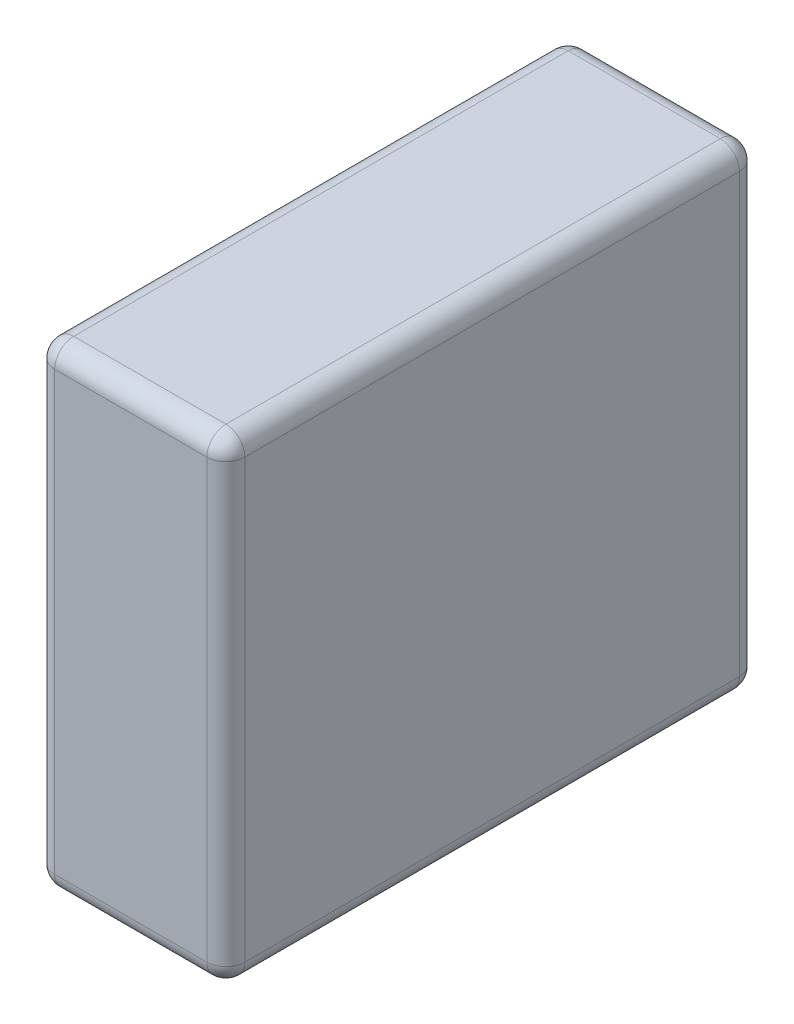
ISO-10303-21;
HEADER;
FILE_DESCRIPTION(('STEP AP214'),'2;1');
FILE_NAME('part.step','',(''),(''),'','','');
FILE_SCHEMA(('AUTOMOTIVE_DESIGN { 1 0 10303 214 1 1 1 1 }'));
ENDSEC;
DATA;
#1=APPLICATION_CONTEXT('core data for automotive mechanical design processes');
#2=APPLICATION_PROTOCOL_DEFINITION('international standard','automotive_design',2000,#1);
#3=PRODUCT_CONTEXT('',#1,'mechanical');
#4=PRODUCT('Part','Part','',(#3));
#5=PRODUCT_RELATED_PRODUCT_CATEGORY('part','',(#4));
#6=PRODUCT_DEFINITION_FORMATION('','',#4);
#7=PRODUCT_DEFINITION_CONTEXT('part definition',#1,'design');
#8=PRODUCT_DEFINITION('design','',#6,#7);
#9=PRODUCT_DEFINITION_SHAPE('','',#8);
#10=(LENGTH_UNIT() NAMED_UNIT(*) SI_UNIT(.MILLI.,.METRE.));
#11=(NAMED_UNIT(*) PLANE_ANGLE_UNIT() SI_UNIT($,.RADIAN.));
#12=(NAMED_UNIT(*) SI_UNIT($,.STERADIAN.) SOLID_ANGLE_UNIT());
#13=UNCERTAINTY_MEASURE_WITH_UNIT(LENGTH_MEASURE(1.E-05),#10,'distance_accuracy_value','');
#14=(GEOMETRIC_REPRESENTATION_CONTEXT(3) GLOBAL_UNCERTAINTY_ASSIGNED_CONTEXT((#13)) GLOBAL_UNIT_ASSIGNED_CONTEXT((#10,
#11,#12)) REPRESENTATION_CONTEXT('',''));
#15=CARTESIAN_POINT('',(0.,0.,0.));
#16=DIRECTION('',(0.,0.,1.));
#17=DIRECTION('',(1.,0.,0.));
#18=AXIS2_PLACEMENT_3D('',#15,#16,#17);
#19=CARTESIAN_POINT('',(-1.,-0.625,0.));
#20=DIRECTION('',(1.,0.,0.));
#21=DIRECTION('',(0.,1.,0.));
#22=AXIS2_PLACEMENT_3D('',#19,#20,#21);
#23=PLANE('',#22);
#24=DIRECTION('',(0.,1.,0.));
#25=VECTOR('',#24,1.);
#26=CARTESIAN_POINT('',(-1.,-0.625,1.35));
#27=LINE('',#26,#25);
#28=CARTESIAN_POINT('',(-1.,-0.575,1.35));
#29=VERTEX_POINT('',#28);
#30=CARTESIAN_POINT('',(-1.,0.575,1.35));
#31=VERTEX_POINT('',#30);
#32=EDGE_CURVE('E228',#29,#31,#27,.T.);
#33=ORIENTED_EDGE('',*,*,#32,.T.);
#34=DIRECTION('',(0.,0.,1.));
#35=VECTOR('',#34,1.);
#36=CARTESIAN_POINT('',(-1.,0.575,0.));
#37=LINE('',#36,#35);
#38=CARTESIAN_POINT('',(-1.,0.575,0.05));
#39=VERTEX_POINT('',#38);
#40=EDGE_CURVE('E198',#39,#31,#37,.T.);
#41=ORIENTED_EDGE('',*,*,#40,.F.);
#42=DIRECTION('',(0.,1.,0.));
#43=VECTOR('',#42,1.);
#44=CARTESIAN_POINT('',(-1.,-0.625,0.05));
#45=LINE('',#44,#43);
#46=CARTESIAN_POINT('',(-1.,-0.575,0.05));
#47=VERTEX_POINT('',#46);
#48=EDGE_CURVE('E27',#47,#39,#45,.T.);
#49=ORIENTED_EDGE('',*,*,#48,.F.);
#50=DIRECTION('',(0.,0.,1.));
#51=VECTOR('',#50,1.);
#52=CARTESIAN_POINT('',(-1.,-0.575,0.));
#53=LINE('',#52,#51);
#54=EDGE_CURVE('E11',#47,#29,#53,.T.);
#55=ORIENTED_EDGE('',*,*,#54,.T.);
#56=EDGE_LOOP('',(#33,#41,#49,#55));
#57=FACE_BOUND('',#56,.T.);
#58=ADVANCED_FACE('F16',(#57),#23,.F.);
#59=CARTESIAN_POINT('',(-0.95,-0.575,0.));
#60=DIRECTION('',(0.,0.,1.));
#61=DIRECTION('',(-1.,0.,0.));
#62=AXIS2_PLACEMENT_3D('',#59,#60,#61);
#63=CYLINDRICAL_SURFACE('',#62,0.05);
#64=ORIENTED_EDGE('',*,*,#54,.F.);
#65=CARTESIAN_POINT('',(-0.95,-0.575,0.05));
#66=DIRECTION('',(0.,0.,1.));
#67=DIRECTION('',(-1.,0.,0.));
#68=AXIS2_PLACEMENT_3D('',#65,#66,#67);
#69=CIRCLE('',#68,0.05);
#70=CARTESIAN_POINT('',(-0.95,-0.625,0.05));
#71=VERTEX_POINT('',#70);
#72=EDGE_CURVE('E195',#47,#71,#69,.T.);
#73=ORIENTED_EDGE('',*,*,#72,.T.);
#74=DIRECTION('',(0.,0.,1.));
#75=VECTOR('',#74,1.);
#76=CARTESIAN_POINT('',(-0.95,-0.625,0.));
#77=LINE('',#76,#75);
#78=CARTESIAN_POINT('',(-0.95,-0.625,1.35));
#79=VERTEX_POINT('',#78);
#80=EDGE_CURVE('E191',#71,#79,#77,.T.);
#81=ORIENTED_EDGE('',*,*,#80,.T.);
#82=CARTESIAN_POINT('',(-0.95,-0.575,1.35));
#83=DIRECTION('',(0.,0.,1.));
#84=DIRECTION('',(-1.,0.,0.));
#85=AXIS2_PLACEMENT_3D('',#82,#83,#84);
#86=CIRCLE('',#85,0.05);
#87=EDGE_CURVE('E187',#29,#79,#86,.T.);
#88=ORIENTED_EDGE('',*,*,#87,.F.);
#89=EDGE_LOOP('',(#64,#73,#81,#88));
#90=FACE_BOUND('',#89,.T.);
#91=ADVANCED_FACE('F288',(#90),#63,.T.);
#92=CARTESIAN_POINT('',(-0.95,-0.625,0.05));
#93=DIRECTION('',(0.,1.,0.));
#94=DIRECTION('',(-1.,0.,0.));
#95=AXIS2_PLACEMENT_3D('',#92,#93,#94);
#96=CYLINDRICAL_SURFACE('',#95,0.05);
#97=ORIENTED_EDGE('',*,*,#48,.T.);
#98=CARTESIAN_POINT('',(-0.95,0.575,0.05));
#99=DIRECTION('',(0.,1.,0.));
#100=DIRECTION('',(-1.,0.,0.));
#101=AXIS2_PLACEMENT_3D('',#98,#99,#100);
#102=CIRCLE('',#101,0.05);
#103=CARTESIAN_POINT('',(-0.95,0.575,0.));
#104=VERTEX_POINT('',#103);
#105=EDGE_CURVE('E247',#104,#39,#102,.T.);
#106=ORIENTED_EDGE('',*,*,#105,.F.);
#107=DIRECTION('',(0.,1.,0.));
#108=VECTOR('',#107,1.);
#109=CARTESIAN_POINT('',(-0.95,-0.625,0.));
#110=LINE('',#109,#108);
#111=CARTESIAN_POINT('',(-0.95,-0.575,0.));
#112=VERTEX_POINT('',#111);
#113=EDGE_CURVE('E203',#112,#104,#110,.T.);
#114=ORIENTED_EDGE('',*,*,#113,.F.);
#115=CARTESIAN_POINT('',(-0.95,-0.575,0.05));
#116=DIRECTION('',(0.,1.,0.));
#117=DIRECTION('',(-1.,0.,0.));
#118=AXIS2_PLACEMENT_3D('',#115,#116,#117);
#119=CIRCLE('',#118,0.05);
#120=EDGE_CURVE('E199',#112,#47,#119,.T.);
#121=ORIENTED_EDGE('',*,*,#120,.T.);
#122=EDGE_LOOP('',(#97,#106,#114,#121));
#123=FACE_BOUND('',#122,.T.);
#124=ADVANCED_FACE('F280',(#123),#96,.T.);
#125=CARTESIAN_POINT('',(-0.95,-0.625,1.35));
#126=DIRECTION('',(0.,1.,0.));
#127=DIRECTION('',(-1.,0.,0.));
#128=AXIS2_PLACEMENT_3D('',#125,#126,#127);
#129=CYLINDRICAL_SURFACE('',#128,0.05);
#130=CARTESIAN_POINT('',(-0.95,-0.575,1.35));
#131=DIRECTION('',(0.,-1.,0.));
#132=DIRECTION('',(-1.,0.,0.));
#133=AXIS2_PLACEMENT_3D('',#130,#131,#132);
#134=CIRCLE('',#133,0.05);
#135=CARTESIAN_POINT('',(-0.95,-0.575,1.4));
#136=VERTEX_POINT('',#135);
#137=EDGE_CURVE('E190',#136,#29,#134,.T.);
#138=ORIENTED_EDGE('',*,*,#137,.F.);
#139=DIRECTION('',(0.,1.,0.));
#140=VECTOR('',#139,1.);
#141=CARTESIAN_POINT('',(-0.95,-0.625,1.4));
#142=LINE('',#141,#140);
#143=CARTESIAN_POINT('',(-0.95,0.575,1.4));
#144=VERTEX_POINT('',#143);
#145=EDGE_CURVE('E20',#136,#144,#142,.T.);
#146=ORIENTED_EDGE('',*,*,#145,.T.);
#147=CARTESIAN_POINT('',(-0.95,0.575,1.35));
#148=DIRECTION('',(0.,1.,0.));
#149=DIRECTION('',(-1.,0.,0.));
#150=AXIS2_PLACEMENT_3D('',#147,#148,#149);
#151=CIRCLE('',#150,0.05);
#152=EDGE_CURVE('E181',#31,#144,#151,.T.);
#153=ORIENTED_EDGE('',*,*,#152,.F.);
#154=ORIENTED_EDGE('',*,*,#32,.F.);
#155=EDGE_LOOP('',(#138,#146,#153,#154));
#156=FACE_BOUND('',#155,.T.);
#157=ADVANCED_FACE('F384',(#156),#129,.T.);
#158=CARTESIAN_POINT('',(-0.95,0.575,0.));
#159=DIRECTION('',(0.,0.,1.));
#160=DIRECTION('',(-1.,0.,0.));
#161=AXIS2_PLACEMENT_3D('',#158,#159,#160);
#162=CYLINDRICAL_SURFACE('',#161,0.05);
#163=CARTESIAN_POINT('',(-0.95,0.575,1.35));
#164=DIRECTION('',(0.,0.,1.));
#165=DIRECTION('',(-1.,0.,0.));
#166=AXIS2_PLACEMENT_3D('',#163,#164,#165);
#167=CIRCLE('',#166,0.05);
#168=CARTESIAN_POINT('',(-0.95,0.625,1.35));
#169=VERTEX_POINT('',#168);
#170=EDGE_CURVE('E185',#169,#31,#167,.T.);
#171=ORIENTED_EDGE('',*,*,#170,.F.);
#172=DIRECTION('',(0.,0.,1.));
#173=VECTOR('',#172,1.);
#174=CARTESIAN_POINT('',(-0.95,0.625,0.));
#175=LINE('',#174,#173);
#176=CARTESIAN_POINT('',(-0.95,0.625,0.05));
#177=VERTEX_POINT('',#176);
#178=EDGE_CURVE('E186',#177,#169,#175,.T.);
#179=ORIENTED_EDGE('',*,*,#178,.F.);
#180=CARTESIAN_POINT('',(-0.95,0.575,0.05));
#181=DIRECTION('',(0.,0.,-1.));
#182=DIRECTION('',(-1.,0.,0.));
#183=AXIS2_PLACEMENT_3D('',#180,#181,#182);
#184=CIRCLE('',#183,0.05);
#185=EDGE_CURVE('E266',#39,#177,#184,.T.);
#186=ORIENTED_EDGE('',*,*,#185,.F.);
#187=ORIENTED_EDGE('',*,*,#40,.T.);
#188=EDGE_LOOP('',(#171,#179,#186,#187));
#189=FACE_BOUND('',#188,.T.);
#190=ADVANCED_FACE('F378',(#189),#162,.T.);
#191=CARTESIAN_POINT('',(-0.95,-0.575,0.05));
#192=DIRECTION('',(0.,-1.,0.));
#193=DIRECTION('',(-1.,0.,0.));
#194=AXIS2_PLACEMENT_3D('',#191,#192,#193);
#195=SPHERICAL_SURFACE('',#194,0.05);
#196=ORIENTED_EDGE('',*,*,#120,.F.);
#197=CARTESIAN_POINT('',(-0.95,-0.575,0.05));
#198=DIRECTION('',(-1.,0.,0.));
#199=DIRECTION('',(0.,-1.,0.));
#200=AXIS2_PLACEMENT_3D('',#197,#198,#199);
#201=CIRCLE('',#200,0.05);
#202=EDGE_CURVE('E211',#112,#71,#201,.T.);
#203=ORIENTED_EDGE('',*,*,#202,.T.);
#204=ORIENTED_EDGE('',*,*,#72,.F.);
#205=EDGE_LOOP('',(#196,#203,#204));
#206=FACE_BOUND('',#205,.T.);
#207=ADVANCED_FACE('F286',(#206),#195,.T.);
#208=CARTESIAN_POINT('',(-0.95,-0.575,1.35));
#209=DIRECTION('',(0.,1.,0.));
#210=DIRECTION('',(-1.,0.,0.));
#211=AXIS2_PLACEMENT_3D('',#208,#209,#210);
#212=SPHERICAL_SURFACE('',#211,0.05);
#213=ORIENTED_EDGE('',*,*,#87,.T.);
#214=CARTESIAN_POINT('',(-0.95,-0.575,1.35));
#215=DIRECTION('',(1.,0.,0.));
#216=DIRECTION('',(0.,-1.,0.));
#217=AXIS2_PLACEMENT_3D('',#214,#215,#216);
#218=CIRCLE('',#217,0.05);
#219=EDGE_CURVE('E140',#136,#79,#218,.T.);
#220=ORIENTED_EDGE('',*,*,#219,.F.);
#221=ORIENTED_EDGE('',*,*,#137,.T.);
#222=EDGE_LOOP('',(#213,#220,#221));
#223=FACE_BOUND('',#222,.T.);
#224=ADVANCED_FACE('F608',(#223),#212,.T.);
#225=CARTESIAN_POINT('',(-1.,-0.625,0.));
#226=DIRECTION('',(0.,1.,0.));
#227=DIRECTION('',(1.,0.,0.));
#228=AXIS2_PLACEMENT_3D('',#225,#226,#227);
#229=PLANE('',#228);
#230=DIRECTION('',(1.,0.,0.));
#231=VECTOR('',#230,1.);
#232=CARTESIAN_POINT('',(-1.,-0.625,0.05));
#233=LINE('',#232,#231);
#234=CARTESIAN_POINT('',(-0.55,-0.625,0.05));
#235=VERTEX_POINT('',#234);
#236=EDGE_CURVE('E151',#71,#235,#233,.T.);
#237=ORIENTED_EDGE('',*,*,#236,.T.);
#238=DIRECTION('',(0.,0.,1.));
#239=VECTOR('',#238,1.);
#240=CARTESIAN_POINT('',(-0.55,-0.625,0.));
#241=LINE('',#240,#239);
#242=CARTESIAN_POINT('',(-0.55,-0.625,1.35));
#243=VERTEX_POINT('',#242);
#244=EDGE_CURVE('E145',#235,#243,#241,.T.);
#245=ORIENTED_EDGE('',*,*,#244,.T.);
#246=DIRECTION('',(1.,0.,0.));
#247=VECTOR('',#246,1.);
#248=CARTESIAN_POINT('',(-1.,-0.625,1.35));
#249=LINE('',#248,#247);
#250=EDGE_CURVE('E132',#79,#243,#249,.T.);
#251=ORIENTED_EDGE('',*,*,#250,.F.);
#252=ORIENTED_EDGE('',*,*,#80,.F.);
#253=EDGE_LOOP('',(#237,#245,#251,#252));
#254=FACE_BOUND('',#253,.T.);
#255=ADVANCED_FACE('F149',(#254),#229,.F.);
#256=CARTESIAN_POINT('',(-1.,-0.625,0.));
#257=DIRECTION('',(0.,0.,1.));
#258=DIRECTION('',(1.,0.,0.));
#259=AXIS2_PLACEMENT_3D('',#256,#257,#258);
#260=PLANE('',#259);
#261=DIRECTION('',(1.,0.,0.));
#262=VECTOR('',#261,1.);
#263=CARTESIAN_POINT('',(-1.,0.575,0.));
#264=LINE('',#263,#262);
#265=CARTESIAN_POINT('',(-0.55,0.575,0.));
#266=VERTEX_POINT('',#265);
#267=EDGE_CURVE('E215',#104,#266,#264,.T.);
#268=ORIENTED_EDGE('',*,*,#267,.T.);
#269=DIRECTION('',(0.,1.,0.));
#270=VECTOR('',#269,1.);
#271=CARTESIAN_POINT('',(-0.55,-0.625,0.));
#272=LINE('',#271,#270);
#273=CARTESIAN_POINT('',(-0.55,-0.575,0.));
#274=VERTEX_POINT('',#273);
#275=EDGE_CURVE('E265',#274,#266,#272,.T.);
#276=ORIENTED_EDGE('',*,*,#275,.F.);
#277=DIRECTION('',(1.,0.,0.));
#278=VECTOR('',#277,1.);
#279=CARTESIAN_POINT('',(-1.,-0.575,0.));
#280=LINE('',#279,#278);
#281=EDGE_CURVE('E180',#112,#274,#280,.T.);
#282=ORIENTED_EDGE('',*,*,#281,.F.);
#283=ORIENTED_EDGE('',*,*,#113,.T.);
#284=EDGE_LOOP('',(#268,#276,#282,#283));
#285=FACE_BOUND('',#284,.T.);
#286=ADVANCED_FACE('F568',(#285),#260,.F.);
#287=CARTESIAN_POINT('',(-0.95,0.575,0.05));
#288=DIRECTION('',(0.,-1.,0.));
#289=DIRECTION('',(-1.,0.,0.));
#290=AXIS2_PLACEMENT_3D('',#287,#288,#289);
#291=SPHERICAL_SURFACE('',#290,0.05);
#292=ORIENTED_EDGE('',*,*,#185,.T.);
#293=CARTESIAN_POINT('',(-0.95,0.575,0.05));
#294=DIRECTION('',(1.,0.,0.));
#295=DIRECTION('',(0.,1.,0.));
#296=AXIS2_PLACEMENT_3D('',#293,#294,#295);
#297=CIRCLE('',#296,0.05);
#298=EDGE_CURVE('E156',#104,#177,#297,.T.);
#299=ORIENTED_EDGE('',*,*,#298,.F.);
#300=ORIENTED_EDGE('',*,*,#105,.T.);
#301=EDGE_LOOP('',(#292,#299,#300));
#302=FACE_BOUND('',#301,.T.);
#303=ADVANCED_FACE('F376',(#302),#291,.T.);
#304=CARTESIAN_POINT('',(-1.,-0.625,1.4));
#305=DIRECTION('',(0.,0.,1.));
#306=DIRECTION('',(1.,0.,0.));
#307=AXIS2_PLACEMENT_3D('',#304,#305,#306);
#308=PLANE('',#307);
#309=ORIENTED_EDGE('',*,*,#145,.F.);
#310=DIRECTION('',(1.,0.,0.));
#311=VECTOR('',#310,1.);
#312=CARTESIAN_POINT('',(-1.,-0.575,1.4));
#313=LINE('',#312,#311);
#314=CARTESIAN_POINT('',(-0.55,-0.575,1.4));
#315=VERTEX_POINT('',#314);
#316=EDGE_CURVE('E144',#136,#315,#313,.T.);
#317=ORIENTED_EDGE('',*,*,#316,.T.);
#318=DIRECTION('',(0.,1.,0.));
#319=VECTOR('',#318,1.);
#320=CARTESIAN_POINT('',(-0.55,-0.625,1.4));
#321=LINE('',#320,#319);
#322=CARTESIAN_POINT('',(-0.55,0.575,1.4));
#323=VERTEX_POINT('',#322);
#324=EDGE_CURVE('E223',#315,#323,#321,.T.);
#325=ORIENTED_EDGE('',*,*,#324,.T.);
#326=DIRECTION('',(1.,0.,0.));
#327=VECTOR('',#326,1.);
#328=CARTESIAN_POINT('',(-1.,0.575,1.4));
#329=LINE('',#328,#327);
#330=EDGE_CURVE('E252',#144,#323,#329,.T.);
#331=ORIENTED_EDGE('',*,*,#330,.F.);
#332=EDGE_LOOP('',(#309,#317,#325,#331));
#333=FACE_BOUND('',#332,.T.);
#334=ADVANCED_FACE('F331',(#333),#308,.T.);
#335=CARTESIAN_POINT('',(-0.95,0.575,1.35));
#336=DIRECTION('',(0.,0.,-1.));
#337=DIRECTION('',(-1.,0.,0.));
#338=AXIS2_PLACEMENT_3D('',#335,#336,#337);
#339=SPHERICAL_SURFACE('',#338,0.05);
#340=ORIENTED_EDGE('',*,*,#152,.T.);
#341=CARTESIAN_POINT('',(-0.95,0.575,1.35));
#342=DIRECTION('',(1.,0.,0.));
#343=DIRECTION('',(0.,0.,1.));
#344=AXIS2_PLACEMENT_3D('',#341,#342,#343);
#345=CIRCLE('',#344,0.05);
#346=EDGE_CURVE('E248',#169,#144,#345,.T.);
#347=ORIENTED_EDGE('',*,*,#346,.F.);
#348=ORIENTED_EDGE('',*,*,#170,.T.);
#349=EDGE_LOOP('',(#340,#347,#348));
#350=FACE_BOUND('',#349,.T.);
#351=ADVANCED_FACE('F381',(#350),#339,.T.);
#352=CARTESIAN_POINT('',(-1.,0.625,0.));
#353=DIRECTION('',(0.,1.,0.));
#354=DIRECTION('',(1.,0.,0.));
#355=AXIS2_PLACEMENT_3D('',#352,#353,#354);
#356=PLANE('',#355);
#357=ORIENTED_EDGE('',*,*,#178,.T.);
#358=DIRECTION('',(1.,0.,0.));
#359=VECTOR('',#358,1.);
#360=CARTESIAN_POINT('',(-1.,0.625,1.35));
#361=LINE('',#360,#359);
#362=CARTESIAN_POINT('',(-0.55,0.625,1.35));
#363=VERTEX_POINT('',#362);
#364=EDGE_CURVE('E261',#169,#363,#361,.T.);
#365=ORIENTED_EDGE('',*,*,#364,.T.);
#366=DIRECTION('',(0.,0.,1.));
#367=VECTOR('',#366,1.);
#368=CARTESIAN_POINT('',(-0.55,0.625,0.));
#369=LINE('',#368,#367);
#370=CARTESIAN_POINT('',(-0.55,0.625,0.05));
#371=VERTEX_POINT('',#370);
#372=EDGE_CURVE('E219',#371,#363,#369,.T.);
#373=ORIENTED_EDGE('',*,*,#372,.F.);
#374=DIRECTION('',(1.,0.,0.));
#375=VECTOR('',#374,1.);
#376=CARTESIAN_POINT('',(-1.,0.625,0.05));
#377=LINE('',#376,#375);
#378=EDGE_CURVE('E218',#177,#371,#377,.T.);
#379=ORIENTED_EDGE('',*,*,#378,.F.);
#380=EDGE_LOOP('',(#357,#365,#373,#379));
#381=FACE_BOUND('',#380,.T.);
#382=ADVANCED_FACE('F18',(#381),#356,.T.);
#383=CARTESIAN_POINT('',(-1.,-0.575,0.05));
#384=DIRECTION('',(1.,0.,0.));
#385=DIRECTION('',(0.,-1.,0.));
#386=AXIS2_PLACEMENT_3D('',#383,#384,#385);
#387=CYLINDRICAL_SURFACE('',#386,0.05);
#388=ORIENTED_EDGE('',*,*,#202,.F.);
#389=ORIENTED_EDGE('',*,*,#281,.T.);
#390=CARTESIAN_POINT('',(-0.55,-0.575,0.05));
#391=DIRECTION('',(-1.,0.,0.));
#392=DIRECTION('',(0.,-1.,0.));
#393=AXIS2_PLACEMENT_3D('',#390,#391,#392);
#394=CIRCLE('',#393,0.05);
#395=EDGE_CURVE('E239',#274,#235,#394,.T.);
#396=ORIENTED_EDGE('',*,*,#395,.T.);
#397=ORIENTED_EDGE('',*,*,#236,.F.);
#398=EDGE_LOOP('',(#388,#389,#396,#397));
#399=FACE_BOUND('',#398,.T.);
#400=ADVANCED_FACE('F290',(#399),#387,.T.);
#401=CARTESIAN_POINT('',(-1.,-0.575,1.35));
#402=DIRECTION('',(1.,0.,0.));
#403=DIRECTION('',(0.,-1.,0.));
#404=AXIS2_PLACEMENT_3D('',#401,#402,#403);
#405=CYLINDRICAL_SURFACE('',#404,0.05);
#406=ORIENTED_EDGE('',*,*,#250,.T.);
#407=CARTESIAN_POINT('',(-0.55,-0.575,1.35));
#408=DIRECTION('',(1.,0.,0.));
#409=DIRECTION('',(0.,-1.,0.));
#410=AXIS2_PLACEMENT_3D('',#407,#408,#409);
#411=CIRCLE('',#410,0.05);
#412=EDGE_CURVE('E137',#315,#243,#411,.T.);
#413=ORIENTED_EDGE('',*,*,#412,.F.);
#414=ORIENTED_EDGE('',*,*,#316,.F.);
#415=ORIENTED_EDGE('',*,*,#219,.T.);
#416=EDGE_LOOP('',(#406,#413,#414,#415));
#417=FACE_BOUND('',#416,.T.);
#418=ADVANCED_FACE('F134',(#417),#405,.T.);
#419=CARTESIAN_POINT('',(-0.55,-0.575,0.));
#420=DIRECTION('',(0.,0.,1.));
#421=DIRECTION('',(1.,0.,0.));
#422=AXIS2_PLACEMENT_3D('',#419,#420,#421);
#423=CYLINDRICAL_SURFACE('',#422,0.05);
#424=CARTESIAN_POINT('',(-0.55,-0.575,1.35));
#425=DIRECTION('',(0.,0.,-1.));
#426=DIRECTION('',(1.,0.,0.));
#427=AXIS2_PLACEMENT_3D('',#424,#425,#426);
#428=CIRCLE('',#427,0.05);
#429=CARTESIAN_POINT('',(-0.5,-0.575,1.35));
#430=VERTEX_POINT('',#429);
#431=EDGE_CURVE('E159',#430,#243,#428,.T.);
#432=ORIENTED_EDGE('',*,*,#431,.T.);
#433=ORIENTED_EDGE('',*,*,#244,.F.);
#434=CARTESIAN_POINT('',(-0.55,-0.575,0.05));
#435=DIRECTION('',(0.,0.,-1.));
#436=DIRECTION('',(1.,0.,0.));
#437=AXIS2_PLACEMENT_3D('',#434,#435,#436);
#438=CIRCLE('',#437,0.05);
#439=CARTESIAN_POINT('',(-0.5,-0.575,0.05));
#440=VERTEX_POINT('',#439);
#441=EDGE_CURVE('E166',#440,#235,#438,.T.);
#442=ORIENTED_EDGE('',*,*,#441,.F.);
#443=DIRECTION('',(0.,0.,1.));
#444=VECTOR('',#443,1.);
#445=CARTESIAN_POINT('',(-0.5,-0.575,0.));
#446=LINE('',#445,#444);
#447=EDGE_CURVE('E162',#440,#430,#446,.T.);
#448=ORIENTED_EDGE('',*,*,#447,.T.);
#449=EDGE_LOOP('',(#432,#433,#442,#448));
#450=FACE_BOUND('',#449,.T.);
#451=ADVANCED_FACE('F160',(#450),#423,.T.);
#452=CARTESIAN_POINT('',(-1.,0.575,0.05));
#453=DIRECTION('',(1.,0.,0.));
#454=DIRECTION('',(0.,1.,0.));
#455=AXIS2_PLACEMENT_3D('',#452,#453,#454);
#456=CYLINDRICAL_SURFACE('',#455,0.05);
#457=ORIENTED_EDGE('',*,*,#378,.T.);
#458=CARTESIAN_POINT('',(-0.55,0.575,0.05));
#459=DIRECTION('',(1.,0.,0.));
#460=DIRECTION('',(0.,1.,0.));
#461=AXIS2_PLACEMENT_3D('',#458,#459,#460);
#462=CIRCLE('',#461,0.05);
#463=EDGE_CURVE('E208',#266,#371,#462,.T.);
#464=ORIENTED_EDGE('',*,*,#463,.F.);
#465=ORIENTED_EDGE('',*,*,#267,.F.);
#466=ORIENTED_EDGE('',*,*,#298,.T.);
#467=EDGE_LOOP('',(#457,#464,#465,#466));
#468=FACE_BOUND('',#467,.T.);
#469=ADVANCED_FACE('F362',(#468),#456,.T.);
#470=CARTESIAN_POINT('',(-0.55,-0.625,0.05));
#471=DIRECTION('',(0.,1.,0.));
#472=DIRECTION('',(1.,0.,0.));
#473=AXIS2_PLACEMENT_3D('',#470,#471,#472);
#474=CYLINDRICAL_SURFACE('',#473,0.05);
#475=CARTESIAN_POINT('',(-0.55,-0.575,0.05));
#476=DIRECTION('',(0.,-1.,0.));
#477=DIRECTION('',(1.,0.,0.));
#478=AXIS2_PLACEMENT_3D('',#475,#476,#477);
#479=CIRCLE('',#478,0.05);
#480=EDGE_CURVE('E224',#274,#440,#479,.T.);
#481=ORIENTED_EDGE('',*,*,#480,.F.);
#482=ORIENTED_EDGE('',*,*,#275,.T.);
#483=CARTESIAN_POINT('',(-0.55,0.575,0.05));
#484=DIRECTION('',(0.,-1.,0.));
#485=DIRECTION('',(1.,0.,0.));
#486=AXIS2_PLACEMENT_3D('',#483,#484,#485);
#487=CIRCLE('',#486,0.05);
#488=CARTESIAN_POINT('',(-0.5,0.575,0.05));
#489=VERTEX_POINT('',#488);
#490=EDGE_CURVE('E255',#266,#489,#487,.T.);
#491=ORIENTED_EDGE('',*,*,#490,.T.);
#492=DIRECTION('',(0.,1.,0.));
#493=VECTOR('',#492,1.);
#494=CARTESIAN_POINT('',(-0.5,-0.625,0.05));
#495=LINE('',#494,#493);
#496=EDGE_CURVE('E302',#440,#489,#495,.T.);
#497=ORIENTED_EDGE('',*,*,#496,.F.);
#498=EDGE_LOOP('',(#481,#482,#491,#497));
#499=FACE_BOUND('',#498,.T.);
#500=ADVANCED_FACE('F671',(#499),#474,.T.);
#501=CARTESIAN_POINT('',(-1.,0.575,1.35));
#502=DIRECTION('',(1.,0.,0.));
#503=DIRECTION('',(0.,1.,0.));
#504=AXIS2_PLACEMENT_3D('',#501,#502,#503);
#505=CYLINDRICAL_SURFACE('',#504,0.05);
#506=ORIENTED_EDGE('',*,*,#346,.T.);
#507=ORIENTED_EDGE('',*,*,#330,.T.);
#508=CARTESIAN_POINT('',(-0.55,0.575,1.35));
#509=DIRECTION('',(1.,0.,0.));
#510=DIRECTION('',(0.,0.,1.));
#511=AXIS2_PLACEMENT_3D('',#508,#509,#510);
#512=CIRCLE('',#511,0.05);
#513=EDGE_CURVE('E269',#363,#323,#512,.T.);
#514=ORIENTED_EDGE('',*,*,#513,.F.);
#515=ORIENTED_EDGE('',*,*,#364,.F.);
#516=EDGE_LOOP('',(#506,#507,#514,#515));
#517=FACE_BOUND('',#516,.T.);
#518=ADVANCED_FACE('F343',(#517),#505,.T.);
#519=CARTESIAN_POINT('',(-0.55,-0.625,1.35));
#520=DIRECTION('',(0.,1.,0.));
#521=DIRECTION('',(1.,0.,0.));
#522=AXIS2_PLACEMENT_3D('',#519,#520,#521);
#523=CYLINDRICAL_SURFACE('',#522,0.05);
#524=DIRECTION('',(0.,1.,0.));
#525=VECTOR('',#524,1.);
#526=CARTESIAN_POINT('',(-0.5,-0.625,1.35));
#527=LINE('',#526,#525);
#528=CARTESIAN_POINT('',(-0.5,0.575,1.35));
#529=VERTEX_POINT('',#528);
#530=EDGE_CURVE('E176',#430,#529,#527,.T.);
#531=ORIENTED_EDGE('',*,*,#530,.T.);
#532=CARTESIAN_POINT('',(-0.55,0.575,1.35));
#533=DIRECTION('',(0.,-1.,0.));
#534=DIRECTION('',(1.,0.,0.));
#535=AXIS2_PLACEMENT_3D('',#532,#533,#534);
#536=CIRCLE('',#535,0.05);
#537=EDGE_CURVE('E272',#529,#323,#536,.T.);
#538=ORIENTED_EDGE('',*,*,#537,.T.);
#539=ORIENTED_EDGE('',*,*,#324,.F.);
#540=CARTESIAN_POINT('',(-0.55,-0.575,1.35));
#541=DIRECTION('',(0.,1.,0.));
#542=DIRECTION('',(1.,0.,0.));
#543=AXIS2_PLACEMENT_3D('',#540,#541,#542);
#544=CIRCLE('',#543,0.05);
#545=EDGE_CURVE('E169',#315,#430,#544,.T.);
#546=ORIENTED_EDGE('',*,*,#545,.T.);
#547=EDGE_LOOP('',(#531,#538,#539,#546));
#548=FACE_BOUND('',#547,.T.);
#549=ADVANCED_FACE('F334',(#548),#523,.T.);
#550=CARTESIAN_POINT('',(-0.55,0.575,0.));
#551=DIRECTION('',(0.,0.,1.));
#552=DIRECTION('',(1.,0.,0.));
#553=AXIS2_PLACEMENT_3D('',#550,#551,#552);
#554=CYLINDRICAL_SURFACE('',#553,0.05);
#555=DIRECTION('',(0.,0.,1.));
#556=VECTOR('',#555,1.);
#557=CARTESIAN_POINT('',(-0.5,0.575,0.));
#558=LINE('',#557,#556);
#559=EDGE_CURVE('E194',#489,#529,#558,.T.);
#560=ORIENTED_EDGE('',*,*,#559,.F.);
#561=CARTESIAN_POINT('',(-0.55,0.575,0.05));
#562=DIRECTION('',(0.,0.,1.));
#563=DIRECTION('',(1.,0.,0.));
#564=AXIS2_PLACEMENT_3D('',#561,#562,#563);
#565=CIRCLE('',#564,0.05);
#566=EDGE_CURVE('E204',#489,#371,#565,.T.);
#567=ORIENTED_EDGE('',*,*,#566,.T.);
#568=ORIENTED_EDGE('',*,*,#372,.T.);
#569=CARTESIAN_POINT('',(-0.55,0.575,1.35));
#570=DIRECTION('',(0.,0.,-1.));
#571=DIRECTION('',(1.,0.,0.));
#572=AXIS2_PLACEMENT_3D('',#569,#570,#571);
#573=CIRCLE('',#572,0.05);
#574=EDGE_CURVE('E273',#363,#529,#573,.T.);
#575=ORIENTED_EDGE('',*,*,#574,.T.);
#576=EDGE_LOOP('',(#560,#567,#568,#575));
#577=FACE_BOUND('',#576,.T.);
#578=ADVANCED_FACE('F353',(#577),#554,.T.);
#579=CARTESIAN_POINT('',(-0.55,-0.575,0.05));
#580=DIRECTION('',(0.,1.,0.));
#581=DIRECTION('',(1.,0.,0.));
#582=AXIS2_PLACEMENT_3D('',#579,#580,#581);
#583=SPHERICAL_SURFACE('',#582,0.05);
#584=ORIENTED_EDGE('',*,*,#441,.T.);
#585=ORIENTED_EDGE('',*,*,#395,.F.);
#586=ORIENTED_EDGE('',*,*,#480,.T.);
#587=EDGE_LOOP('',(#584,#585,#586));
#588=FACE_BOUND('',#587,.T.);
#589=ADVANCED_FACE('F638',(#588),#583,.T.);
#590=CARTESIAN_POINT('',(-0.55,-0.575,1.35));
#591=DIRECTION('',(0.,-1.,0.));
#592=DIRECTION('',(1.,0.,0.));
#593=AXIS2_PLACEMENT_3D('',#590,#591,#592);
#594=SPHERICAL_SURFACE('',#593,0.05);
#595=ORIENTED_EDGE('',*,*,#545,.F.);
#596=ORIENTED_EDGE('',*,*,#412,.T.);
#597=ORIENTED_EDGE('',*,*,#431,.F.);
#598=EDGE_LOOP('',(#595,#596,#597));
#599=FACE_BOUND('',#598,.T.);
#600=ADVANCED_FACE('F168',(#599),#594,.T.);
#601=CARTESIAN_POINT('',(-0.5,-0.625,0.));
#602=DIRECTION('',(1.,0.,0.));
#603=DIRECTION('',(0.,1.,0.));
#604=AXIS2_PLACEMENT_3D('',#601,#602,#603);
#605=PLANE('',#604);
#606=ORIENTED_EDGE('',*,*,#447,.F.);
#607=ORIENTED_EDGE('',*,*,#496,.T.);
#608=ORIENTED_EDGE('',*,*,#559,.T.);
#609=ORIENTED_EDGE('',*,*,#530,.F.);
#610=EDGE_LOOP('',(#606,#607,#608,#609));
#611=FACE_BOUND('',#610,.T.);
#612=ADVANCED_FACE('F592',(#611),#605,.T.);
#613=CARTESIAN_POINT('',(-0.55,0.575,0.05));
#614=DIRECTION('',(0.,1.,0.));
#615=DIRECTION('',(1.,0.,0.));
#616=AXIS2_PLACEMENT_3D('',#613,#614,#615);
#617=SPHERICAL_SURFACE('',#616,0.05);
#618=ORIENTED_EDGE('',*,*,#490,.F.);
#619=ORIENTED_EDGE('',*,*,#463,.T.);
#620=ORIENTED_EDGE('',*,*,#566,.F.);
#621=EDGE_LOOP('',(#618,#619,#620));
#622=FACE_BOUND('',#621,.T.);
#623=ADVANCED_FACE('F359',(#622),#617,.T.);
#624=CARTESIAN_POINT('',(-0.55,0.575,1.35));
#625=DIRECTION('',(0.,0.,1.));
#626=DIRECTION('',(1.,0.,0.));
#627=AXIS2_PLACEMENT_3D('',#624,#625,#626);
#628=SPHERICAL_SURFACE('',#627,0.05);
#629=ORIENTED_EDGE('',*,*,#574,.F.);
#630=ORIENTED_EDGE('',*,*,#513,.T.);
#631=ORIENTED_EDGE('',*,*,#537,.F.);
#632=EDGE_LOOP('',(#629,#630,#631));
#633=FACE_BOUND('',#632,.T.);
#634=ADVANCED_FACE('F340',(#633),#628,.T.);
#635=CLOSED_SHELL('',(#58,#91,#124,#157,#190,#207,#224,#255,#286,#303,#334,#351,#382,#400,#418,
#451,#469,#500,#518,#549,#578,#589,#600,#612,#623,#634));
#636=MANIFOLD_SOLID_BREP('B1',#635);
#637=ADVANCED_BREP_SHAPE_REPRESENTATION('',(#18,#636),#14);
#638=SHAPE_DEFINITION_REPRESENTATION(#9,#637);
ENDSEC;
END-ISO-10303-21;
